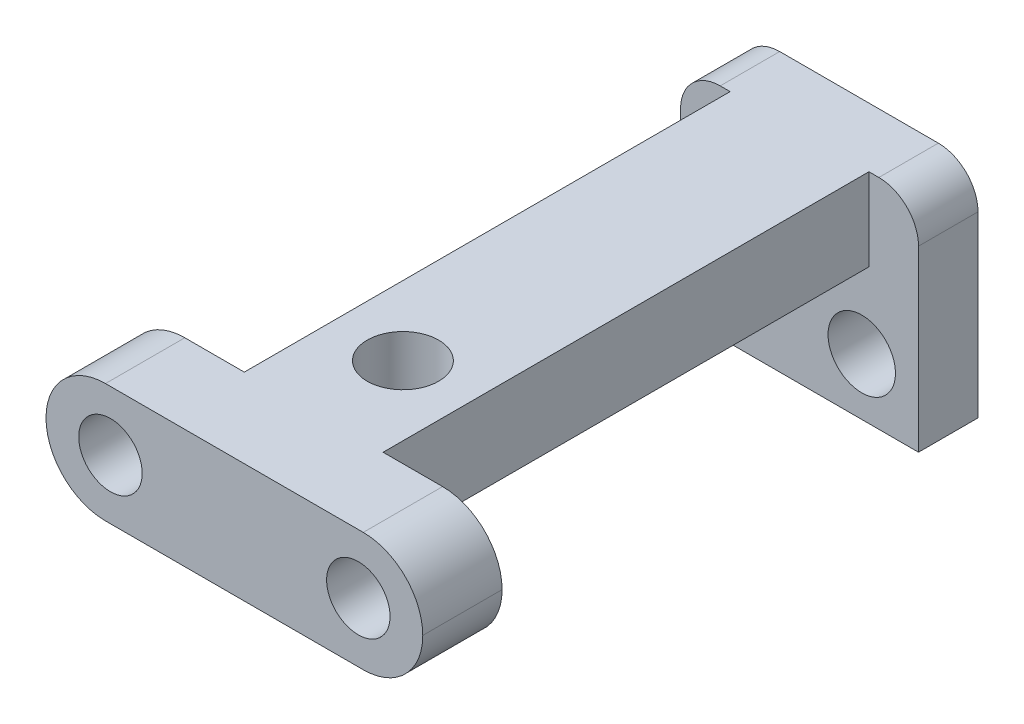
ISO-10303-21;
HEADER;
FILE_DESCRIPTION(('STEP AP214'),'2;1');
FILE_NAME('part.step','',(''),(''),'','','');
FILE_SCHEMA(('AUTOMOTIVE_DESIGN { 1 0 10303 214 1 1 1 1 }'));
ENDSEC;
DATA;
#1=APPLICATION_CONTEXT('core data for automotive mechanical design processes');
#2=APPLICATION_PROTOCOL_DEFINITION('international standard','automotive_design',2000,#1);
#3=PRODUCT_CONTEXT('',#1,'mechanical');
#4=PRODUCT('Part','Part','',(#3));
#5=PRODUCT_RELATED_PRODUCT_CATEGORY('part','',(#4));
#6=PRODUCT_DEFINITION_FORMATION('','',#4);
#7=PRODUCT_DEFINITION_CONTEXT('part definition',#1,'design');
#8=PRODUCT_DEFINITION('design','',#6,#7);
#9=PRODUCT_DEFINITION_SHAPE('','',#8);
#10=(LENGTH_UNIT() NAMED_UNIT(*) SI_UNIT(.MILLI.,.METRE.));
#11=(NAMED_UNIT(*) PLANE_ANGLE_UNIT() SI_UNIT($,.RADIAN.));
#12=(NAMED_UNIT(*) SI_UNIT($,.STERADIAN.) SOLID_ANGLE_UNIT());
#13=UNCERTAINTY_MEASURE_WITH_UNIT(LENGTH_MEASURE(1.E-05),#10,'distance_accuracy_value','');
#14=(GEOMETRIC_REPRESENTATION_CONTEXT(3) GLOBAL_UNCERTAINTY_ASSIGNED_CONTEXT((#13)) GLOBAL_UNIT_ASSIGNED_CONTEXT((#10,
#11,#12)) REPRESENTATION_CONTEXT('',''));
#15=CARTESIAN_POINT('',(0.,0.,0.));
#16=DIRECTION('',(0.,0.,1.));
#17=DIRECTION('',(1.,0.,0.));
#18=AXIS2_PLACEMENT_3D('',#15,#16,#17);
#19=CARTESIAN_POINT('',(0.,0.,28.5));
#20=DIRECTION('',(0.,0.,-1.));
#21=DIRECTION('',(-1.,0.,0.));
#22=AXIS2_PLACEMENT_3D('',#19,#20,#21);
#23=CYLINDRICAL_SURFACE('',#22,40.);
#24=CARTESIAN_POINT('',(0.,40.,21.8));
#25=CARTESIAN_POINT('',(-0.101051914719797,39.999999457016,21.7999955359726));
#26=CARTESIAN_POINT('',(-0.20217579841331,39.9996129659403,21.7914618501219));
#27=CARTESIAN_POINT('',(-0.401634798514853,39.9981083318101,21.7575398127747));
#28=CARTESIAN_POINT('',(-0.499966471947185,39.996989323187,21.7321315211301));
#29=CARTESIAN_POINT('',(-0.690922772210575,39.9941463282659,21.6651884248385));
#30=CARTESIAN_POINT('',(-0.783550245788737,39.9924226466609,21.6236617410828));
#31=CARTESIAN_POINT('',(-0.960494305476465,39.9885645227784,21.5256728875248));
#32=CARTESIAN_POINT('',(-1.04481286673066,39.9864301784791,21.4692142790626));
#33=CARTESIAN_POINT('',(-1.20284227269959,39.9819888780099,21.3429106077246));
#34=CARTESIAN_POINT('',(-1.27654526473791,39.9796817959582,21.2730557233464));
#35=CARTESIAN_POINT('',(-1.41118459720699,39.9751561327293,21.1219616438645));
#36=CARTESIAN_POINT('',(-1.47212042005941,39.9729375551431,21.0407219874474));
#37=CARTESIAN_POINT('',(-1.57951582618926,39.9688382334278,20.869125185014));
#38=CARTESIAN_POINT('',(-1.62596950488977,39.9669576272266,20.7787643399834));
#39=CARTESIAN_POINT('',(-1.70304402326993,39.963747792788,20.591516262423));
#40=CARTESIAN_POINT('',(-1.73366496624174,39.9624185609535,20.4946290724754));
#41=CARTESIAN_POINT('',(-1.77818466726211,39.9604624691031,20.2971487729222));
#42=CARTESIAN_POINT('',(-1.79209484484823,39.9598351294596,20.1965582425489));
#43=CARTESIAN_POINT('',(-1.80283338005946,39.9593521228803,19.9944680848602));
#44=CARTESIAN_POINT('',(-1.79966185269654,39.959496450749,19.8929684636705));
#45=CARTESIAN_POINT('',(-1.77633654044452,39.9605400576052,19.6920188889247));
#46=CARTESIAN_POINT('',(-1.75619509042125,39.9614387882409,19.5925675003516));
#47=CARTESIAN_POINT('',(-1.69952078232798,39.9638890360555,19.3984588593437));
#48=CARTESIAN_POINT('',(-1.66298786481739,39.9654405556016,19.3038016242955));
#49=CARTESIAN_POINT('',(-1.57455354522525,39.9690221348509,19.1219285069495));
#50=CARTESIAN_POINT('',(-1.52264651025507,39.9710523698939,19.0347153671905));
#51=CARTESIAN_POINT('',(-1.40494152334163,39.9753623609457,18.8702361117621));
#52=CARTESIAN_POINT('',(-1.33914349303119,39.9776421183622,18.7929700522138));
#53=CARTESIAN_POINT('',(-1.19545462518403,39.9821966281058,18.6505064515006));
#54=CARTESIAN_POINT('',(-1.11755310311077,39.9844713741921,18.5853196860778));
#55=CARTESIAN_POINT('',(-0.951906176697614,39.9887575108181,18.4689480977805));
#56=CARTESIAN_POINT('',(-0.86416077021833,39.9907689013005,18.417763277949));
#57=CARTESIAN_POINT('',(-0.681310628021468,39.9943016941348,18.3308496092599));
#58=CARTESIAN_POINT('',(-0.586205718526381,39.995823084912,18.295121125499));
#59=CARTESIAN_POINT('',(-0.391339011752936,39.9982042315168,18.2401413230687));
#60=CARTESIAN_POINT('',(-0.291577242751362,39.9990639913611,18.2208899043631));
#61=CARTESIAN_POINT('',(-0.0903222591607361,40.0000244583365,18.1994239671856));
#62=CARTESIAN_POINT('',(0.0111693624451958,40.0001258296116,18.1971945419987));
#63=CARTESIAN_POINT('',(0.213085316249135,39.9995598562656,18.2097969916761));
#64=CARTESIAN_POINT('',(0.313509651294399,39.9988925136958,18.2246288210137));
#65=CARTESIAN_POINT('',(0.51039865003854,39.9968647182223,18.2709204213613));
#66=CARTESIAN_POINT('',(0.606864914556497,39.9955045485747,18.3023733971616));
#67=CARTESIAN_POINT('',(0.793148719896412,39.9922442747655,18.381007567835));
#68=CARTESIAN_POINT('',(0.882966229794925,39.9903441680928,18.4281888358548));
#69=CARTESIAN_POINT('',(1.05347143760494,39.9862162054273,18.5369785221013));
#70=CARTESIAN_POINT('',(1.13415274653934,39.9839881225533,18.5985969449874));
#71=CARTESIAN_POINT('',(1.2840310900569,39.9794559437157,18.7344971825781));
#72=CARTESIAN_POINT('',(1.35322806417522,39.9771518473521,18.8087790639513));
#73=CARTESIAN_POINT('',(1.47822356315217,39.9727254615055,18.9679616872846));
#74=CARTESIAN_POINT('',(1.53401245170323,39.9706033034809,19.0528700001431));
#75=CARTESIAN_POINT('',(1.63054228552971,39.9667821511794,19.230856911139));
#76=CARTESIAN_POINT('',(1.67128328697316,39.965083155323,19.3239354787784));
#77=CARTESIAN_POINT('',(1.73654402350732,39.9623008442568,19.5155848688947));
#78=CARTESIAN_POINT('',(1.76106992850842,39.9612172948893,19.6141535868499));
#79=CARTESIAN_POINT('',(1.79322446244897,39.9597873997389,19.8140148099575));
#80=CARTESIAN_POINT('',(1.80085316318999,39.9594410508234,19.9153073035338));
#81=CARTESIAN_POINT('',(1.79899602386849,39.9595246946806,20.1176447576157));
#82=CARTESIAN_POINT('',(1.78952534925552,39.9599539995255,20.2186898579528));
#83=CARTESIAN_POINT('',(1.75376960904838,39.9615391099764,20.4177540425272));
#84=CARTESIAN_POINT('',(1.72748451096948,39.962694916986,20.5157731209178));
#85=CARTESIAN_POINT('',(1.65884899681329,39.9656026088208,20.7060064721643));
#86=CARTESIAN_POINT('',(1.61649840541597,39.967354500151,20.7982206816598));
#87=CARTESIAN_POINT('',(1.51693704719745,39.9712568355617,20.9742302384845));
#88=CARTESIAN_POINT('',(1.45972676043274,39.9734072667663,21.0580258576629));
#89=CARTESIAN_POINT('',(1.33201693457347,39.9778664386974,21.2148945431379));
#90=CARTESIAN_POINT('',(1.26150708482001,39.9801753013604,21.2879592114304));
#91=CARTESIAN_POINT('',(1.10920151908198,39.9846903629391,21.4212363730932));
#92=CARTESIAN_POINT('',(1.02740302565458,39.98689653641,21.4814456942365));
#93=CARTESIAN_POINT('',(0.854787564323086,39.9909588898273,21.5873258186714));
#94=CARTESIAN_POINT('',(0.763962853833083,39.9928147652666,21.6329839964611));
#95=CARTESIAN_POINT('',(0.575997093234725,39.9959626189959,21.7083491777296));
#96=CARTESIAN_POINT('',(0.478863678791842,39.9972552648908,21.7380750756629));
#97=CARTESIAN_POINT('',(0.317603112098561,39.9987880385604,21.7729107767247));
#98=CARTESIAN_POINT('',(0.254521149372204,39.9992405342942,21.7830563219923));
#99=CARTESIAN_POINT('',(0.127635696366363,39.9998466864074,21.7966023412402));
#100=CARTESIAN_POINT('',(0.0638322065794619,40.0000003429907,21.800002819825));
#101=CARTESIAN_POINT('',(0.,40.,21.8));
#102=B_SPLINE_CURVE_WITH_KNOTS('',3,(#24,#25,#26,#27,#28,#29,#30,#31,#32,#33,#34,#35,#36,#37,
#38,#39,#40,#41,#42,#43,#44,#45,#46,#47,#48,#49,#50,#51,#52,#53,#54,#55,#56,#57,#58,#59,#60,#61,
#62,#63,#64,#65,#66,#67,#68,#69,#70,#71,#72,#73,#74,#75,#76,#77,#78,#79,#80,#81,#82,#83,#84,#85,
#86,#87,#88,#89,#90,#91,#92,#93,#94,#95,#96,#97,#98,#99,#100,#101),.UNSPECIFIED.,.T.,.F.,(4,2,2,
2,2,2,2,2,2,2,2,2,2,2,2,2,2,2,2,2,2,2,2,2,2,2,2,2,2,2,2,2,2,2,2,2,2,2,4),(0.,0.30292273744918,
0.606204066807213,0.909332792580044,1.21238928570471,1.5156688205583,1.81896064792217,
2.12237597046258,2.42578931350836,2.72899519660172,3.03219903819725,3.33518268106364,
3.63816742265226,3.9412633117565,4.24436091084618,4.54772761019765,4.85109437548061,
5.15446830624969,5.45784039515009,5.76094678071034,6.06405235745487,6.36703411155592,
6.67001727474059,6.97321102345696,7.27640636843294,7.57981897072887,7.88323044048949,
8.18652639440096,8.48982105950921,8.79284686446018,9.09587325484546,9.39890295220195,
9.70192286111533,10.0051786629694,10.3085092109409,10.6121022358275,10.915334421674,
11.1066839869744,11.2980334216496),.UNSPECIFIED.);
#103=CARTESIAN_POINT('',(0.,40.,21.8));
#104=VERTEX_POINT('',#103);
#105=EDGE_CURVE('E233',#104,#104,#102,.T.);
#106=ORIENTED_EDGE('',*,*,#105,.F.);
#107=EDGE_LOOP('',(#106));
#108=FACE_BOUND('',#107,.T.);
#109=DIRECTION('',(0.,0.,-1.));
#110=VECTOR('',#109,1.);
#111=CARTESIAN_POINT('',(3.5,39.8465807817936,28.5));
#112=LINE('',#111,#110);
#113=CARTESIAN_POINT('',(3.5,39.8465807817936,24.5));
#114=VERTEX_POINT('',#113);
#115=CARTESIAN_POINT('',(3.5,39.8465807817936,0.));
#116=VERTEX_POINT('',#115);
#117=EDGE_CURVE('E195',#114,#116,#112,.T.);
#118=ORIENTED_EDGE('',*,*,#117,.F.);
#119=CARTESIAN_POINT('',(0.,0.,24.5));
#120=DIRECTION('',(0.,0.,1.));
#121=DIRECTION('',(1.,0.,0.));
#122=AXIS2_PLACEMENT_3D('',#119,#120,#121);
#123=CIRCLE('',#122,40.);
#124=CARTESIAN_POINT('',(-3.5,39.8465807817936,24.5));
#125=VERTEX_POINT('',#124);
#126=EDGE_CURVE('E324',#114,#125,#123,.T.);
#127=ORIENTED_EDGE('',*,*,#126,.T.);
#128=DIRECTION('',(0.,0.,-1.));
#129=VECTOR('',#128,1.);
#130=CARTESIAN_POINT('',(-3.5,39.8465807817936,28.5));
#131=LINE('',#130,#129);
#132=CARTESIAN_POINT('',(-3.5,39.8465807817936,0.));
#133=VERTEX_POINT('',#132);
#134=EDGE_CURVE('E182',#125,#133,#131,.T.);
#135=ORIENTED_EDGE('',*,*,#134,.T.);
#136=CARTESIAN_POINT('',(0.,0.,0.));
#137=DIRECTION('',(0.,0.,1.));
#138=DIRECTION('',(1.,0.,0.));
#139=AXIS2_PLACEMENT_3D('',#136,#137,#138);
#140=CIRCLE('',#139,40.);
#141=EDGE_CURVE('E171',#116,#133,#140,.T.);
#142=ORIENTED_EDGE('',*,*,#141,.F.);
#143=EDGE_LOOP('',(#118,#127,#135,#142));
#144=FACE_BOUND('',#143,.T.);
#145=ADVANCED_FACE('F35',(#108,#144),#23,.F.);
#146=CARTESIAN_POINT('',(3.50000000000001,0.,28.5));
#147=DIRECTION('',(1.,0.,0.));
#148=DIRECTION('',(0.,1.,0.));
#149=AXIS2_PLACEMENT_3D('',#146,#147,#148);
#150=PLANE('',#149);
#151=DIRECTION('',(0.,0.,-1.));
#152=VECTOR('',#151,1.);
#153=CARTESIAN_POINT('',(3.5,44.,28.5));
#154=LINE('',#153,#152);
#155=CARTESIAN_POINT('',(3.5,44.,24.5));
#156=VERTEX_POINT('',#155);
#157=CARTESIAN_POINT('',(3.5,44.,0.));
#158=VERTEX_POINT('',#157);
#159=EDGE_CURVE('E193',#156,#158,#154,.T.);
#160=ORIENTED_EDGE('',*,*,#159,.F.);
#161=DIRECTION('',(0.,-1.,0.));
#162=VECTOR('',#161,1.);
#163=CARTESIAN_POINT('',(3.50000000000001,0.,24.5));
#164=LINE('',#163,#162);
#165=EDGE_CURVE('E313',#156,#114,#164,.T.);
#166=ORIENTED_EDGE('',*,*,#165,.T.);
#167=ORIENTED_EDGE('',*,*,#117,.T.);
#168=DIRECTION('',(0.,-1.,0.));
#169=VECTOR('',#168,1.);
#170=CARTESIAN_POINT('',(3.50000000000001,0.,0.));
#171=LINE('',#170,#169);
#172=EDGE_CURVE('E174',#158,#116,#171,.T.);
#173=ORIENTED_EDGE('',*,*,#172,.F.);
#174=EDGE_LOOP('',(#160,#166,#167,#173));
#175=FACE_BOUND('',#174,.T.);
#176=ADVANCED_FACE('F300',(#175),#150,.T.);
#177=CARTESIAN_POINT('',(-3.5,0.,28.5));
#178=DIRECTION('',(-1.,0.,0.));
#179=DIRECTION('',(0.,0.,1.));
#180=AXIS2_PLACEMENT_3D('',#177,#178,#179);
#181=PLANE('',#180);
#182=ORIENTED_EDGE('',*,*,#134,.F.);
#183=DIRECTION('',(0.,1.,0.));
#184=VECTOR('',#183,1.);
#185=CARTESIAN_POINT('',(-3.5,0.,24.5));
#186=LINE('',#185,#184);
#187=CARTESIAN_POINT('',(-3.5,44.,24.5));
#188=VERTEX_POINT('',#187);
#189=EDGE_CURVE('E197',#125,#188,#186,.T.);
#190=ORIENTED_EDGE('',*,*,#189,.T.);
#191=DIRECTION('',(0.,0.,-1.));
#192=VECTOR('',#191,1.);
#193=CARTESIAN_POINT('',(-3.5,44.,28.5));
#194=LINE('',#193,#192);
#195=CARTESIAN_POINT('',(-3.5,44.,0.));
#196=VERTEX_POINT('',#195);
#197=EDGE_CURVE('E190',#188,#196,#194,.T.);
#198=ORIENTED_EDGE('',*,*,#197,.T.);
#199=DIRECTION('',(0.,1.,0.));
#200=VECTOR('',#199,1.);
#201=CARTESIAN_POINT('',(-3.5,0.,0.));
#202=LINE('',#201,#200);
#203=EDGE_CURVE('E183',#133,#196,#202,.T.);
#204=ORIENTED_EDGE('',*,*,#203,.F.);
#205=EDGE_LOOP('',(#182,#190,#198,#204));
#206=FACE_BOUND('',#205,.T.);
#207=ADVANCED_FACE('F297',(#206),#181,.T.);
#208=CARTESIAN_POINT('',(0.,44.,28.5));
#209=DIRECTION('',(0.,1.,0.));
#210=DIRECTION('',(0.,0.,1.));
#211=AXIS2_PLACEMENT_3D('',#208,#209,#210);
#212=PLANE('',#211);
#213=CARTESIAN_POINT('',(0.,44.,20.));
#214=DIRECTION('',(0.,1.,0.));
#215=DIRECTION('',(0.,0.,1.));
#216=AXIS2_PLACEMENT_3D('',#213,#214,#215);
#217=CIRCLE('',#216,1.8);
#218=CARTESIAN_POINT('',(0.,44.,21.8));
#219=VERTEX_POINT('',#218);
#220=EDGE_CURVE('E241',#219,#219,#217,.T.);
#221=ORIENTED_EDGE('',*,*,#220,.F.);
#222=EDGE_LOOP('',(#221));
#223=FACE_BOUND('',#222,.T.);
#224=DIRECTION('',(1.,0.,0.));
#225=VECTOR('',#224,1.);
#226=CARTESIAN_POINT('',(6.,44.,-3.));
#227=LINE('',#226,#225);
#228=CARTESIAN_POINT('',(-3.99999999999998,44.,-3.));
#229=VERTEX_POINT('',#228);
#230=CARTESIAN_POINT('',(4.,44.,-3.));
#231=VERTEX_POINT('',#230);
#232=EDGE_CURVE('E176',#229,#231,#227,.T.);
#233=ORIENTED_EDGE('',*,*,#232,.F.);
#234=DIRECTION('',(0.,0.,1.));
#235=VECTOR('',#234,1.);
#236=CARTESIAN_POINT('',(-3.99999999999998,44.,0.));
#237=LINE('',#236,#235);
#238=CARTESIAN_POINT('',(-3.99999999999998,44.,0.));
#239=VERTEX_POINT('',#238);
#240=EDGE_CURVE('E356',#229,#239,#237,.T.);
#241=ORIENTED_EDGE('',*,*,#240,.T.);
#242=DIRECTION('',(1.,0.,0.));
#243=VECTOR('',#242,1.);
#244=CARTESIAN_POINT('',(6.,44.,0.));
#245=LINE('',#244,#243);
#246=EDGE_CURVE('E157',#239,#196,#245,.T.);
#247=ORIENTED_EDGE('',*,*,#246,.T.);
#248=ORIENTED_EDGE('',*,*,#197,.F.);
#249=DIRECTION('',(-1.,0.,0.));
#250=VECTOR('',#249,1.);
#251=CARTESIAN_POINT('',(-9.5,44.,24.5));
#252=LINE('',#251,#250);
#253=CARTESIAN_POINT('',(-6.5,44.,24.5));
#254=VERTEX_POINT('',#253);
#255=EDGE_CURVE('E371',#188,#254,#252,.T.);
#256=ORIENTED_EDGE('',*,*,#255,.T.);
#257=DIRECTION('',(0.,0.,1.));
#258=VECTOR('',#257,1.);
#259=CARTESIAN_POINT('',(-6.5,44.,28.5));
#260=LINE('',#259,#258);
#261=CARTESIAN_POINT('',(-6.5,44.,28.5));
#262=VERTEX_POINT('',#261);
#263=EDGE_CURVE('E221',#254,#262,#260,.T.);
#264=ORIENTED_EDGE('',*,*,#263,.T.);
#265=DIRECTION('',(1.,0.,0.));
#266=VECTOR('',#265,1.);
#267=CARTESIAN_POINT('',(0.,44.,28.5));
#268=LINE('',#267,#266);
#269=CARTESIAN_POINT('',(6.5,44.,28.5));
#270=VERTEX_POINT('',#269);
#271=EDGE_CURVE('E180',#262,#270,#268,.T.);
#272=ORIENTED_EDGE('',*,*,#271,.T.);
#273=DIRECTION('',(0.,0.,1.));
#274=VECTOR('',#273,1.);
#275=CARTESIAN_POINT('',(6.5,44.,28.5));
#276=LINE('',#275,#274);
#277=CARTESIAN_POINT('',(6.5,44.,24.5));
#278=VERTEX_POINT('',#277);
#279=EDGE_CURVE('E223',#270,#278,#276,.F.);
#280=ORIENTED_EDGE('',*,*,#279,.T.);
#281=EDGE_CURVE('E321',#278,#156,#252,.T.);
#282=ORIENTED_EDGE('',*,*,#281,.T.);
#283=ORIENTED_EDGE('',*,*,#159,.T.);
#284=CARTESIAN_POINT('',(4.,44.,0.));
#285=VERTEX_POINT('',#284);
#286=EDGE_CURVE('E347',#158,#285,#245,.T.);
#287=ORIENTED_EDGE('',*,*,#286,.T.);
#288=DIRECTION('',(0.,0.,1.));
#289=VECTOR('',#288,1.);
#290=CARTESIAN_POINT('',(4.,44.,-3.));
#291=LINE('',#290,#289);
#292=EDGE_CURVE('E225',#285,#231,#291,.F.);
#293=ORIENTED_EDGE('',*,*,#292,.T.);
#294=EDGE_LOOP('',(#233,#241,#247,#248,#256,#264,#272,#280,#282,#283,#287,#293));
#295=FACE_BOUND('',#294,.T.);
#296=ADVANCED_FACE('F295',(#223,#295),#212,.T.);
#297=CARTESIAN_POINT('',(0.,0.,28.5));
#298=DIRECTION('',(0.,0.,1.));
#299=DIRECTION('',(1.,0.,0.));
#300=AXIS2_PLACEMENT_3D('',#297,#298,#299);
#301=PLANE('',#300);
#302=CARTESIAN_POINT('',(-6.25,41.,28.5));
#303=DIRECTION('',(0.,0.,1.));
#304=DIRECTION('',(1.,0.,0.));
#305=AXIS2_PLACEMENT_3D('',#302,#303,#304);
#306=CIRCLE('',#305,1.6);
#307=CARTESIAN_POINT('',(-4.65,41.,28.5));
#308=VERTEX_POINT('',#307);
#309=EDGE_CURVE('E229',#308,#308,#306,.T.);
#310=ORIENTED_EDGE('',*,*,#309,.F.);
#311=EDGE_LOOP('',(#310));
#312=FACE_BOUND('',#311,.T.);
#313=CARTESIAN_POINT('',(6.25,41.,28.5));
#314=DIRECTION('',(0.,0.,1.));
#315=DIRECTION('',(1.,0.,0.));
#316=AXIS2_PLACEMENT_3D('',#313,#314,#315);
#317=CIRCLE('',#316,1.6);
#318=CARTESIAN_POINT('',(7.84999999999999,41.,28.5));
#319=VERTEX_POINT('',#318);
#320=EDGE_CURVE('E385',#319,#319,#317,.T.);
#321=ORIENTED_EDGE('',*,*,#320,.F.);
#322=EDGE_LOOP('',(#321));
#323=FACE_BOUND('',#322,.T.);
#324=DIRECTION('',(1.,0.,0.));
#325=VECTOR('',#324,1.);
#326=CARTESIAN_POINT('',(-9.5,38.,28.5));
#327=LINE('',#326,#325);
#328=CARTESIAN_POINT('',(-6.5,38.,28.5));
#329=VERTEX_POINT('',#328);
#330=CARTESIAN_POINT('',(6.5,38.,28.5));
#331=VERTEX_POINT('',#330);
#332=EDGE_CURVE('E377',#329,#331,#327,.T.);
#333=ORIENTED_EDGE('',*,*,#332,.T.);
#334=CARTESIAN_POINT('',(6.5,41.,28.5));
#335=DIRECTION('',(0.,0.,1.));
#336=DIRECTION('',(1.,0.,0.));
#337=AXIS2_PLACEMENT_3D('',#334,#335,#336);
#338=CIRCLE('',#337,3.);
#339=CARTESIAN_POINT('',(9.49999999999999,41.,28.5));
#340=VERTEX_POINT('',#339);
#341=EDGE_CURVE('E211',#331,#340,#338,.T.);
#342=ORIENTED_EDGE('',*,*,#341,.T.);
#343=CARTESIAN_POINT('',(6.5,41.,28.5));
#344=DIRECTION('',(0.,0.,1.));
#345=DIRECTION('',(1.,0.,0.));
#346=AXIS2_PLACEMENT_3D('',#343,#344,#345);
#347=CIRCLE('',#346,3.);
#348=EDGE_CURVE('E209',#340,#270,#347,.T.);
#349=ORIENTED_EDGE('',*,*,#348,.T.);
#350=ORIENTED_EDGE('',*,*,#271,.F.);
#351=CARTESIAN_POINT('',(-6.5,41.,28.5));
#352=DIRECTION('',(0.,0.,1.));
#353=DIRECTION('',(1.,0.,0.));
#354=AXIS2_PLACEMENT_3D('',#351,#352,#353);
#355=CIRCLE('',#354,3.);
#356=CARTESIAN_POINT('',(-9.5,41.,28.5));
#357=VERTEX_POINT('',#356);
#358=EDGE_CURVE('E205',#262,#357,#355,.T.);
#359=ORIENTED_EDGE('',*,*,#358,.T.);
#360=CARTESIAN_POINT('',(-6.5,41.,28.5));
#361=DIRECTION('',(0.,0.,1.));
#362=DIRECTION('',(1.,0.,0.));
#363=AXIS2_PLACEMENT_3D('',#360,#361,#362);
#364=CIRCLE('',#363,3.);
#365=EDGE_CURVE('E207',#357,#329,#364,.T.);
#366=ORIENTED_EDGE('',*,*,#365,.T.);
#367=EDGE_LOOP('',(#333,#342,#349,#350,#359,#366));
#368=FACE_BOUND('',#367,.T.);
#369=ADVANCED_FACE('F285',(#312,#323,#368),#301,.T.);
#370=CARTESIAN_POINT('',(0.,0.,0.));
#371=DIRECTION('',(0.,0.,-1.));
#372=DIRECTION('',(-1.,0.,0.));
#373=AXIS2_PLACEMENT_3D('',#370,#371,#372);
#374=PLANE('',#373);
#375=CARTESIAN_POINT('',(3.1376067389157,35.8630091313028,0.));
#376=DIRECTION('',(0.,0.,-1.));
#377=DIRECTION('',(-1.,0.,0.));
#378=AXIS2_PLACEMENT_3D('',#375,#376,#377);
#379=CIRCLE('',#378,1.7);
#380=CARTESIAN_POINT('',(1.4376067389157,35.8630091313028,0.));
#381=VERTEX_POINT('',#380);
#382=EDGE_CURVE('E334',#381,#381,#379,.T.);
#383=ORIENTED_EDGE('',*,*,#382,.T.);
#384=EDGE_LOOP('',(#383));
#385=FACE_BOUND('',#384,.T.);
#386=CARTESIAN_POINT('',(-3.1376067389157,35.8630091313028,0.));
#387=DIRECTION('',(0.,0.,-1.));
#388=DIRECTION('',(-1.,0.,0.));
#389=AXIS2_PLACEMENT_3D('',#386,#387,#388);
#390=CIRCLE('',#389,1.7);
#391=CARTESIAN_POINT('',(-4.8376067389157,35.8630091313028,0.));
#392=VERTEX_POINT('',#391);
#393=EDGE_CURVE('E325',#392,#392,#390,.T.);
#394=ORIENTED_EDGE('',*,*,#393,.T.);
#395=EDGE_LOOP('',(#394));
#396=FACE_BOUND('',#395,.T.);
#397=ORIENTED_EDGE('',*,*,#246,.F.);
#398=CARTESIAN_POINT('',(-3.99999999999998,42.,0.));
#399=DIRECTION('',(0.,0.,-1.));
#400=DIRECTION('',(-1.,0.,0.));
#401=AXIS2_PLACEMENT_3D('',#398,#399,#400);
#402=CIRCLE('',#401,2.);
#403=CARTESIAN_POINT('',(-5.99999999999998,42.,0.));
#404=VERTEX_POINT('',#403);
#405=EDGE_CURVE('E358',#239,#404,#402,.F.);
#406=ORIENTED_EDGE('',*,*,#405,.T.);
#407=DIRECTION('',(0.,1.,0.));
#408=VECTOR('',#407,1.);
#409=CARTESIAN_POINT('',(-5.99999999999998,44.,0.));
#410=LINE('',#409,#408);
#411=CARTESIAN_POINT('',(-6.,33.,0.));
#412=VERTEX_POINT('',#411);
#413=EDGE_CURVE('E346',#412,#404,#410,.T.);
#414=ORIENTED_EDGE('',*,*,#413,.F.);
#415=DIRECTION('',(-1.,0.,0.));
#416=VECTOR('',#415,1.);
#417=CARTESIAN_POINT('',(6.,33.,0.));
#418=LINE('',#417,#416);
#419=CARTESIAN_POINT('',(6.,33.,0.));
#420=VERTEX_POINT('',#419);
#421=EDGE_CURVE('E344',#420,#412,#418,.T.);
#422=ORIENTED_EDGE('',*,*,#421,.F.);
#423=DIRECTION('',(0.,-1.,0.));
#424=VECTOR('',#423,1.);
#425=CARTESIAN_POINT('',(6.,44.,0.));
#426=LINE('',#425,#424);
#427=CARTESIAN_POINT('',(6.,42.,0.));
#428=VERTEX_POINT('',#427);
#429=EDGE_CURVE('E169',#428,#420,#426,.T.);
#430=ORIENTED_EDGE('',*,*,#429,.F.);
#431=CARTESIAN_POINT('',(4.,42.,0.));
#432=DIRECTION('',(0.,0.,-1.));
#433=DIRECTION('',(-1.,0.,0.));
#434=AXIS2_PLACEMENT_3D('',#431,#432,#433);
#435=CIRCLE('',#434,2.);
#436=EDGE_CURVE('E355',#428,#285,#435,.F.);
#437=ORIENTED_EDGE('',*,*,#436,.T.);
#438=ORIENTED_EDGE('',*,*,#286,.F.);
#439=ORIENTED_EDGE('',*,*,#172,.T.);
#440=ORIENTED_EDGE('',*,*,#141,.T.);
#441=ORIENTED_EDGE('',*,*,#203,.T.);
#442=EDGE_LOOP('',(#397,#406,#414,#422,#430,#437,#438,#439,#440,#441));
#443=FACE_BOUND('',#442,.T.);
#444=ADVANCED_FACE('F281',(#385,#396,#443),#374,.F.);
#445=CARTESIAN_POINT('',(0.,0.,-3.));
#446=DIRECTION('',(0.,0.,-1.));
#447=DIRECTION('',(-1.,0.,0.));
#448=AXIS2_PLACEMENT_3D('',#445,#446,#447);
#449=PLANE('',#448);
#450=CARTESIAN_POINT('',(3.1376067389157,35.8630091313028,-3.));
#451=DIRECTION('',(0.,0.,-1.));
#452=DIRECTION('',(-1.,0.,0.));
#453=AXIS2_PLACEMENT_3D('',#450,#451,#452);
#454=CIRCLE('',#453,1.7);
#455=CARTESIAN_POINT('',(1.4376067389157,35.8630091313028,-3.));
#456=VERTEX_POINT('',#455);
#457=EDGE_CURVE('E336',#456,#456,#454,.T.);
#458=ORIENTED_EDGE('',*,*,#457,.F.);
#459=EDGE_LOOP('',(#458));
#460=FACE_BOUND('',#459,.T.);
#461=DIRECTION('',(0.,1.,0.));
#462=VECTOR('',#461,1.);
#463=CARTESIAN_POINT('',(-5.99999999999998,44.,-3.));
#464=LINE('',#463,#462);
#465=CARTESIAN_POINT('',(-6.,33.,-3.));
#466=VERTEX_POINT('',#465);
#467=CARTESIAN_POINT('',(-5.99999999999998,42.,-3.));
#468=VERTEX_POINT('',#467);
#469=EDGE_CURVE('E165',#466,#468,#464,.T.);
#470=ORIENTED_EDGE('',*,*,#469,.T.);
#471=CARTESIAN_POINT('',(-3.99999999999998,42.,-3.));
#472=DIRECTION('',(0.,0.,-1.));
#473=DIRECTION('',(-1.,0.,0.));
#474=AXIS2_PLACEMENT_3D('',#471,#472,#473);
#475=CIRCLE('',#474,2.);
#476=EDGE_CURVE('E43',#468,#229,#475,.T.);
#477=ORIENTED_EDGE('',*,*,#476,.T.);
#478=ORIENTED_EDGE('',*,*,#232,.T.);
#479=CARTESIAN_POINT('',(4.,42.,-3.));
#480=DIRECTION('',(0.,0.,-1.));
#481=DIRECTION('',(-1.,0.,0.));
#482=AXIS2_PLACEMENT_3D('',#479,#480,#481);
#483=CIRCLE('',#482,2.);
#484=CARTESIAN_POINT('',(6.,42.,-3.));
#485=VERTEX_POINT('',#484);
#486=EDGE_CURVE('E50',#231,#485,#483,.T.);
#487=ORIENTED_EDGE('',*,*,#486,.T.);
#488=DIRECTION('',(0.,-1.,0.));
#489=VECTOR('',#488,1.);
#490=CARTESIAN_POINT('',(6.,44.,-3.));
#491=LINE('',#490,#489);
#492=CARTESIAN_POINT('',(6.,33.,-3.));
#493=VERTEX_POINT('',#492);
#494=EDGE_CURVE('E148',#485,#493,#491,.T.);
#495=ORIENTED_EDGE('',*,*,#494,.T.);
#496=DIRECTION('',(-1.,0.,0.));
#497=VECTOR('',#496,1.);
#498=CARTESIAN_POINT('',(6.,33.,-3.));
#499=LINE('',#498,#497);
#500=EDGE_CURVE('E152',#493,#466,#499,.T.);
#501=ORIENTED_EDGE('',*,*,#500,.T.);
#502=EDGE_LOOP('',(#470,#477,#478,#487,#495,#501));
#503=FACE_BOUND('',#502,.T.);
#504=CARTESIAN_POINT('',(-3.1376067389157,35.8630091313028,-3.));
#505=DIRECTION('',(0.,0.,-1.));
#506=DIRECTION('',(-1.,0.,0.));
#507=AXIS2_PLACEMENT_3D('',#504,#505,#506);
#508=CIRCLE('',#507,1.7);
#509=CARTESIAN_POINT('',(-4.8376067389157,35.8630091313028,-3.));
#510=VERTEX_POINT('',#509);
#511=EDGE_CURVE('E328',#510,#510,#508,.T.);
#512=ORIENTED_EDGE('',*,*,#511,.F.);
#513=EDGE_LOOP('',(#512));
#514=FACE_BOUND('',#513,.T.);
#515=ADVANCED_FACE('F150',(#460,#503,#514),#449,.T.);
#516=CARTESIAN_POINT('',(6.,44.,-3.));
#517=DIRECTION('',(-1.,0.,0.));
#518=DIRECTION('',(0.,-1.,0.));
#519=AXIS2_PLACEMENT_3D('',#516,#517,#518);
#520=PLANE('',#519);
#521=ORIENTED_EDGE('',*,*,#494,.F.);
#522=DIRECTION('',(0.,0.,1.));
#523=VECTOR('',#522,1.);
#524=CARTESIAN_POINT('',(6.,42.,0.));
#525=LINE('',#524,#523);
#526=EDGE_CURVE('E11',#485,#428,#525,.T.);
#527=ORIENTED_EDGE('',*,*,#526,.T.);
#528=ORIENTED_EDGE('',*,*,#429,.T.);
#529=DIRECTION('',(0.,0.,1.));
#530=VECTOR('',#529,1.);
#531=CARTESIAN_POINT('',(6.,33.,-3.));
#532=LINE('',#531,#530);
#533=EDGE_CURVE('E162',#493,#420,#532,.T.);
#534=ORIENTED_EDGE('',*,*,#533,.F.);
#535=EDGE_LOOP('',(#521,#527,#528,#534));
#536=FACE_BOUND('',#535,.T.);
#537=ADVANCED_FACE('F167',(#536),#520,.F.);
#538=CARTESIAN_POINT('',(6.,33.,-3.));
#539=DIRECTION('',(0.,1.,0.));
#540=DIRECTION('',(0.,0.,1.));
#541=AXIS2_PLACEMENT_3D('',#538,#539,#540);
#542=PLANE('',#541);
#543=ORIENTED_EDGE('',*,*,#421,.T.);
#544=DIRECTION('',(0.,0.,1.));
#545=VECTOR('',#544,1.);
#546=CARTESIAN_POINT('',(-6.,33.,-3.));
#547=LINE('',#546,#545);
#548=EDGE_CURVE('E164',#466,#412,#547,.T.);
#549=ORIENTED_EDGE('',*,*,#548,.F.);
#550=ORIENTED_EDGE('',*,*,#500,.F.);
#551=ORIENTED_EDGE('',*,*,#533,.T.);
#552=EDGE_LOOP('',(#543,#549,#550,#551));
#553=FACE_BOUND('',#552,.T.);
#554=ADVANCED_FACE('F161',(#553),#542,.F.);
#555=CARTESIAN_POINT('',(-5.99999999999998,44.,-3.));
#556=DIRECTION('',(1.,0.,0.));
#557=DIRECTION('',(0.,1.,0.));
#558=AXIS2_PLACEMENT_3D('',#555,#556,#557);
#559=PLANE('',#558);
#560=ORIENTED_EDGE('',*,*,#413,.T.);
#561=DIRECTION('',(0.,0.,1.));
#562=VECTOR('',#561,1.);
#563=CARTESIAN_POINT('',(-5.99999999999998,42.,-3.));
#564=LINE('',#563,#562);
#565=EDGE_CURVE('E58',#404,#468,#564,.F.);
#566=ORIENTED_EDGE('',*,*,#565,.T.);
#567=ORIENTED_EDGE('',*,*,#469,.F.);
#568=ORIENTED_EDGE('',*,*,#548,.T.);
#569=EDGE_LOOP('',(#560,#566,#567,#568));
#570=FACE_BOUND('',#569,.T.);
#571=ADVANCED_FACE('F277',(#570),#559,.F.);
#572=CARTESIAN_POINT('',(3.1376067389157,35.8630091313028,-3.));
#573=DIRECTION('',(0.,0.,1.));
#574=DIRECTION('',(1.,0.,0.));
#575=AXIS2_PLACEMENT_3D('',#572,#573,#574);
#576=CYLINDRICAL_SURFACE('',#575,1.7);
#577=ORIENTED_EDGE('',*,*,#457,.T.);
#578=EDGE_LOOP('',(#577));
#579=FACE_BOUND('',#578,.T.);
#580=ORIENTED_EDGE('',*,*,#382,.F.);
#581=EDGE_LOOP('',(#580));
#582=FACE_BOUND('',#581,.T.);
#583=ADVANCED_FACE('F273',(#579,#582),#576,.F.);
#584=CARTESIAN_POINT('',(-3.1376067389157,35.8630091313028,-3.));
#585=DIRECTION('',(0.,0.,1.));
#586=DIRECTION('',(1.,0.,0.));
#587=AXIS2_PLACEMENT_3D('',#584,#585,#586);
#588=CYLINDRICAL_SURFACE('',#587,1.7);
#589=ORIENTED_EDGE('',*,*,#511,.T.);
#590=EDGE_LOOP('',(#589));
#591=FACE_BOUND('',#590,.T.);
#592=ORIENTED_EDGE('',*,*,#393,.F.);
#593=EDGE_LOOP('',(#592));
#594=FACE_BOUND('',#593,.T.);
#595=ADVANCED_FACE('F269',(#591,#594),#588,.F.);
#596=CARTESIAN_POINT('',(-9.5,38.,24.5));
#597=DIRECTION('',(0.,-1.,0.));
#598=DIRECTION('',(1.,0.,0.));
#599=AXIS2_PLACEMENT_3D('',#596,#597,#598);
#600=PLANE('',#599);
#601=DIRECTION('',(1.,0.,0.));
#602=VECTOR('',#601,1.);
#603=CARTESIAN_POINT('',(-9.5,38.,24.5));
#604=LINE('',#603,#602);
#605=CARTESIAN_POINT('',(-6.5,38.,24.5));
#606=VERTEX_POINT('',#605);
#607=CARTESIAN_POINT('',(6.5,38.,24.5));
#608=VERTEX_POINT('',#607);
#609=EDGE_CURVE('E374',#606,#608,#604,.T.);
#610=ORIENTED_EDGE('',*,*,#609,.T.);
#611=DIRECTION('',(0.,0.,1.));
#612=VECTOR('',#611,1.);
#613=CARTESIAN_POINT('',(6.5,38.,24.5));
#614=LINE('',#613,#612);
#615=EDGE_CURVE('E202',#608,#331,#614,.T.);
#616=ORIENTED_EDGE('',*,*,#615,.T.);
#617=ORIENTED_EDGE('',*,*,#332,.F.);
#618=DIRECTION('',(0.,0.,1.));
#619=VECTOR('',#618,1.);
#620=CARTESIAN_POINT('',(-6.5,38.,24.5));
#621=LINE('',#620,#619);
#622=EDGE_CURVE('E199',#329,#606,#621,.F.);
#623=ORIENTED_EDGE('',*,*,#622,.T.);
#624=EDGE_LOOP('',(#610,#616,#617,#623));
#625=FACE_BOUND('',#624,.T.);
#626=ADVANCED_FACE('F265',(#625),#600,.T.);
#627=CARTESIAN_POINT('',(0.,0.,24.5));
#628=DIRECTION('',(0.,0.,1.));
#629=DIRECTION('',(1.,0.,0.));
#630=AXIS2_PLACEMENT_3D('',#627,#628,#629);
#631=PLANE('',#630);
#632=CARTESIAN_POINT('',(-6.25,41.,24.5));
#633=DIRECTION('',(0.,0.,1.));
#634=DIRECTION('',(1.,0.,0.));
#635=AXIS2_PLACEMENT_3D('',#632,#633,#634);
#636=CIRCLE('',#635,1.6);
#637=CARTESIAN_POINT('',(-4.65,41.,24.5));
#638=VERTEX_POINT('',#637);
#639=EDGE_CURVE('E389',#638,#638,#636,.T.);
#640=ORIENTED_EDGE('',*,*,#639,.T.);
#641=EDGE_LOOP('',(#640));
#642=FACE_BOUND('',#641,.T.);
#643=CARTESIAN_POINT('',(6.25,41.,24.5));
#644=DIRECTION('',(0.,0.,1.));
#645=DIRECTION('',(1.,0.,0.));
#646=AXIS2_PLACEMENT_3D('',#643,#644,#645);
#647=CIRCLE('',#646,1.6);
#648=CARTESIAN_POINT('',(7.84999999999999,41.,24.5));
#649=VERTEX_POINT('',#648);
#650=EDGE_CURVE('E381',#649,#649,#647,.T.);
#651=ORIENTED_EDGE('',*,*,#650,.T.);
#652=EDGE_LOOP('',(#651));
#653=FACE_BOUND('',#652,.T.);
#654=CARTESIAN_POINT('',(6.5,41.,24.5));
#655=DIRECTION('',(0.,0.,1.));
#656=DIRECTION('',(1.,0.,0.));
#657=AXIS2_PLACEMENT_3D('',#654,#655,#656);
#658=CIRCLE('',#657,3.);
#659=CARTESIAN_POINT('',(9.49999999999999,41.,24.5));
#660=VERTEX_POINT('',#659);
#661=EDGE_CURVE('E217',#278,#660,#658,.F.);
#662=ORIENTED_EDGE('',*,*,#661,.T.);
#663=CARTESIAN_POINT('',(6.5,41.,24.5));
#664=DIRECTION('',(0.,0.,1.));
#665=DIRECTION('',(1.,0.,0.));
#666=AXIS2_PLACEMENT_3D('',#663,#664,#665);
#667=CIRCLE('',#666,3.);
#668=EDGE_CURVE('E219',#660,#608,#667,.F.);
#669=ORIENTED_EDGE('',*,*,#668,.T.);
#670=ORIENTED_EDGE('',*,*,#609,.F.);
#671=CARTESIAN_POINT('',(-6.5,41.,24.5));
#672=DIRECTION('',(0.,0.,1.));
#673=DIRECTION('',(1.,0.,0.));
#674=AXIS2_PLACEMENT_3D('',#671,#672,#673);
#675=CIRCLE('',#674,3.);
#676=CARTESIAN_POINT('',(-9.5,41.,24.5));
#677=VERTEX_POINT('',#676);
#678=EDGE_CURVE('E215',#606,#677,#675,.F.);
#679=ORIENTED_EDGE('',*,*,#678,.T.);
#680=CARTESIAN_POINT('',(-6.5,41.,24.5));
#681=DIRECTION('',(0.,0.,1.));
#682=DIRECTION('',(1.,0.,0.));
#683=AXIS2_PLACEMENT_3D('',#680,#681,#682);
#684=CIRCLE('',#683,3.);
#685=EDGE_CURVE('E213',#677,#254,#684,.F.);
#686=ORIENTED_EDGE('',*,*,#685,.T.);
#687=ORIENTED_EDGE('',*,*,#255,.F.);
#688=ORIENTED_EDGE('',*,*,#189,.F.);
#689=ORIENTED_EDGE('',*,*,#126,.F.);
#690=ORIENTED_EDGE('',*,*,#165,.F.);
#691=ORIENTED_EDGE('',*,*,#281,.F.);
#692=EDGE_LOOP('',(#662,#669,#670,#679,#686,#687,#688,#689,#690,#691));
#693=FACE_BOUND('',#692,.T.);
#694=ADVANCED_FACE('F261',(#642,#653,#693),#631,.F.);
#695=CARTESIAN_POINT('',(6.25,41.,28.5));
#696=DIRECTION('',(0.,0.,1.));
#697=DIRECTION('',(1.,0.,0.));
#698=AXIS2_PLACEMENT_3D('',#695,#696,#697);
#699=CYLINDRICAL_SURFACE('',#698,1.6);
#700=ORIENTED_EDGE('',*,*,#650,.F.);
#701=EDGE_LOOP('',(#700));
#702=FACE_BOUND('',#701,.T.);
#703=ORIENTED_EDGE('',*,*,#320,.T.);
#704=EDGE_LOOP('',(#703));
#705=FACE_BOUND('',#704,.T.);
#706=ADVANCED_FACE('F257',(#702,#705),#699,.F.);
#707=CARTESIAN_POINT('',(-6.25,41.,28.5));
#708=DIRECTION('',(0.,0.,1.));
#709=DIRECTION('',(1.,0.,0.));
#710=AXIS2_PLACEMENT_3D('',#707,#708,#709);
#711=CYLINDRICAL_SURFACE('',#710,1.6);
#712=ORIENTED_EDGE('',*,*,#639,.F.);
#713=EDGE_LOOP('',(#712));
#714=FACE_BOUND('',#713,.T.);
#715=ORIENTED_EDGE('',*,*,#309,.T.);
#716=EDGE_LOOP('',(#715));
#717=FACE_BOUND('',#716,.T.);
#718=ADVANCED_FACE('F253',(#714,#717),#711,.F.);
#719=CARTESIAN_POINT('',(6.5,41.,24.5));
#720=DIRECTION('',(0.,0.,1.));
#721=DIRECTION('',(1.,0.,0.));
#722=AXIS2_PLACEMENT_3D('',#719,#720,#721);
#723=CYLINDRICAL_SURFACE('',#722,3.);
#724=DIRECTION('',(0.,0.,1.));
#725=VECTOR('',#724,1.);
#726=CARTESIAN_POINT('',(9.49999999999999,41.,24.5));
#727=LINE('',#726,#725);
#728=EDGE_CURVE('E226',#660,#340,#727,.T.);
#729=ORIENTED_EDGE('',*,*,#728,.F.);
#730=ORIENTED_EDGE('',*,*,#661,.F.);
#731=ORIENTED_EDGE('',*,*,#279,.F.);
#732=ORIENTED_EDGE('',*,*,#348,.F.);
#733=EDGE_LOOP('',(#729,#730,#731,#732));
#734=FACE_BOUND('',#733,.T.);
#735=ADVANCED_FACE('F256',(#734),#723,.T.);
#736=CARTESIAN_POINT('',(6.5,41.,24.5));
#737=DIRECTION('',(0.,0.,1.));
#738=DIRECTION('',(1.,0.,0.));
#739=AXIS2_PLACEMENT_3D('',#736,#737,#738);
#740=CYLINDRICAL_SURFACE('',#739,3.);
#741=ORIENTED_EDGE('',*,*,#668,.F.);
#742=ORIENTED_EDGE('',*,*,#728,.T.);
#743=ORIENTED_EDGE('',*,*,#341,.F.);
#744=ORIENTED_EDGE('',*,*,#615,.F.);
#745=EDGE_LOOP('',(#741,#742,#743,#744));
#746=FACE_BOUND('',#745,.T.);
#747=ADVANCED_FACE('F421',(#746),#740,.T.);
#748=CARTESIAN_POINT('',(-6.5,41.,28.5));
#749=DIRECTION('',(0.,0.,1.));
#750=DIRECTION('',(1.,0.,0.));
#751=AXIS2_PLACEMENT_3D('',#748,#749,#750);
#752=CYLINDRICAL_SURFACE('',#751,3.);
#753=ORIENTED_EDGE('',*,*,#263,.F.);
#754=ORIENTED_EDGE('',*,*,#685,.F.);
#755=DIRECTION('',(0.,0.,1.));
#756=VECTOR('',#755,1.);
#757=CARTESIAN_POINT('',(-9.5,41.,24.5));
#758=LINE('',#757,#756);
#759=EDGE_CURVE('E230',#357,#677,#758,.F.);
#760=ORIENTED_EDGE('',*,*,#759,.F.);
#761=ORIENTED_EDGE('',*,*,#358,.F.);
#762=EDGE_LOOP('',(#753,#754,#760,#761));
#763=FACE_BOUND('',#762,.T.);
#764=ADVANCED_FACE('F413',(#763),#752,.T.);
#765=CARTESIAN_POINT('',(-6.5,41.,24.5));
#766=DIRECTION('',(0.,0.,1.));
#767=DIRECTION('',(1.,0.,0.));
#768=AXIS2_PLACEMENT_3D('',#765,#766,#767);
#769=CYLINDRICAL_SURFACE('',#768,3.);
#770=ORIENTED_EDGE('',*,*,#678,.F.);
#771=ORIENTED_EDGE('',*,*,#622,.F.);
#772=ORIENTED_EDGE('',*,*,#365,.F.);
#773=ORIENTED_EDGE('',*,*,#759,.T.);
#774=EDGE_LOOP('',(#770,#771,#772,#773));
#775=FACE_BOUND('',#774,.T.);
#776=ADVANCED_FACE('F251',(#775),#769,.T.);
#777=CARTESIAN_POINT('',(0.,44.,20.));
#778=DIRECTION('',(0.,1.,0.));
#779=DIRECTION('',(0.,0.,1.));
#780=AXIS2_PLACEMENT_3D('',#777,#778,#779);
#781=CYLINDRICAL_SURFACE('',#780,1.8);
#782=ORIENTED_EDGE('',*,*,#105,.T.);
#783=EDGE_LOOP('',(#782));
#784=FACE_BOUND('',#783,.T.);
#785=ORIENTED_EDGE('',*,*,#220,.T.);
#786=EDGE_LOOP('',(#785));
#787=FACE_BOUND('',#786,.T.);
#788=ADVANCED_FACE('F246',(#784,#787),#781,.F.);
#789=CARTESIAN_POINT('',(-3.99999999999998,42.,28.5));
#790=DIRECTION('',(0.,0.,-1.));
#791=DIRECTION('',(-1.,0.,0.));
#792=AXIS2_PLACEMENT_3D('',#789,#790,#791);
#793=CYLINDRICAL_SURFACE('',#792,2.);
#794=ORIENTED_EDGE('',*,*,#476,.F.);
#795=ORIENTED_EDGE('',*,*,#565,.F.);
#796=ORIENTED_EDGE('',*,*,#405,.F.);
#797=ORIENTED_EDGE('',*,*,#240,.F.);
#798=EDGE_LOOP('',(#794,#795,#796,#797));
#799=FACE_BOUND('',#798,.T.);
#800=ADVANCED_FACE('F250',(#799),#793,.T.);
#801=CARTESIAN_POINT('',(4.,42.,-3.));
#802=DIRECTION('',(0.,0.,-1.));
#803=DIRECTION('',(-1.,0.,0.));
#804=AXIS2_PLACEMENT_3D('',#801,#802,#803);
#805=CYLINDRICAL_SURFACE('',#804,2.);
#806=ORIENTED_EDGE('',*,*,#486,.F.);
#807=ORIENTED_EDGE('',*,*,#292,.F.);
#808=ORIENTED_EDGE('',*,*,#436,.F.);
#809=ORIENTED_EDGE('',*,*,#526,.F.);
#810=EDGE_LOOP('',(#806,#807,#808,#809));
#811=FACE_BOUND('',#810,.T.);
#812=ADVANCED_FACE('F37',(#811),#805,.T.);
#813=CLOSED_SHELL('',(#145,#176,#207,#296,#369,#444,#515,#537,#554,#571,#583,#595,#626,#694,
#706,#718,#735,#747,#764,#776,#788,#800,#812));
#814=MANIFOLD_SOLID_BREP('B2',#813);
#815=ADVANCED_BREP_SHAPE_REPRESENTATION('',(#18,#814),#14);
#816=SHAPE_DEFINITION_REPRESENTATION(#9,#815);
ENDSEC;
END-ISO-10303-21;
